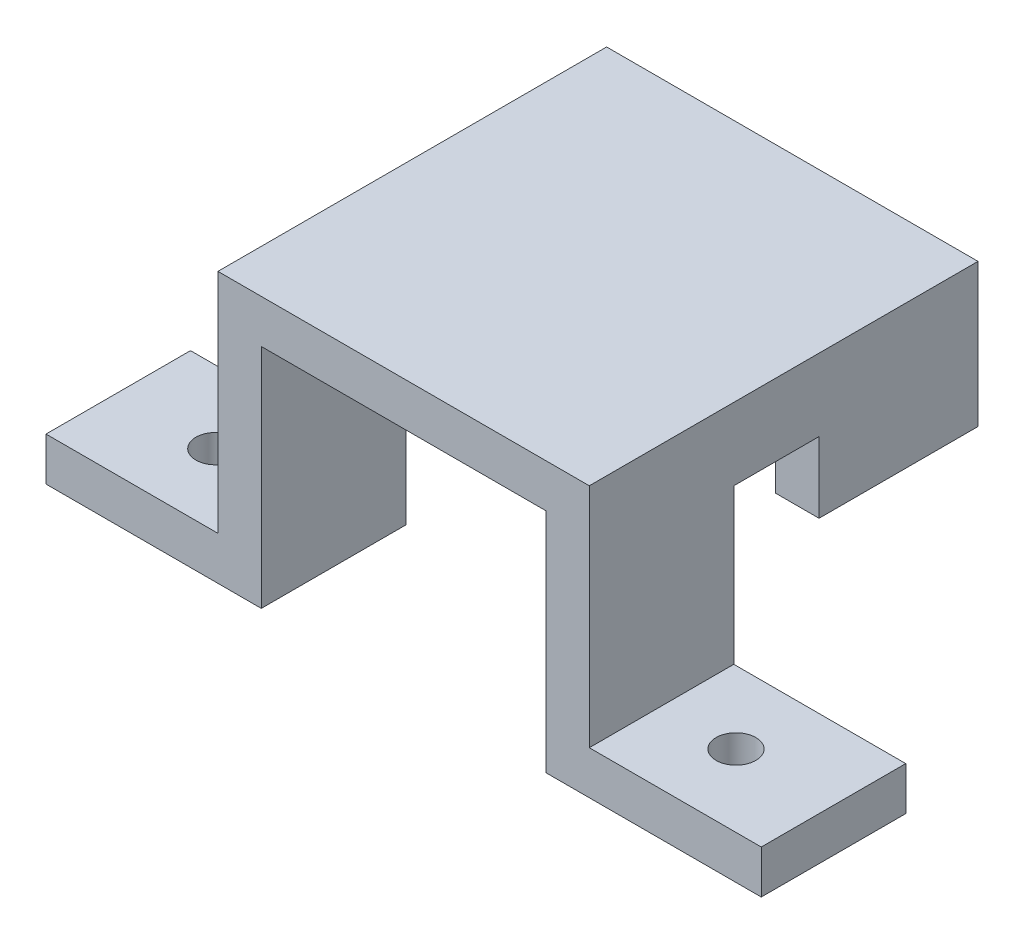
ISO-10303-21;
HEADER;
FILE_DESCRIPTION(('STEP AP214'),'2;1');
FILE_NAME('part.step','',(''),(''),'','','');
FILE_SCHEMA(('AUTOMOTIVE_DESIGN { 1 0 10303 214 1 1 1 1 }'));
ENDSEC;
DATA;
#1=APPLICATION_CONTEXT('core data for automotive mechanical design processes');
#2=APPLICATION_PROTOCOL_DEFINITION('international standard','automotive_design',2000,#1);
#3=PRODUCT_CONTEXT('',#1,'mechanical');
#4=PRODUCT('Part','Part','',(#3));
#5=PRODUCT_RELATED_PRODUCT_CATEGORY('part','',(#4));
#6=PRODUCT_DEFINITION_FORMATION('','',#4);
#7=PRODUCT_DEFINITION_CONTEXT('part definition',#1,'design');
#8=PRODUCT_DEFINITION('design','',#6,#7);
#9=PRODUCT_DEFINITION_SHAPE('','',#8);
#10=(LENGTH_UNIT() NAMED_UNIT(*) SI_UNIT(.MILLI.,.METRE.));
#11=(NAMED_UNIT(*) PLANE_ANGLE_UNIT() SI_UNIT($,.RADIAN.));
#12=(NAMED_UNIT(*) SI_UNIT($,.STERADIAN.) SOLID_ANGLE_UNIT());
#13=UNCERTAINTY_MEASURE_WITH_UNIT(LENGTH_MEASURE(1.E-05),#10,'distance_accuracy_value','');
#14=(GEOMETRIC_REPRESENTATION_CONTEXT(3) GLOBAL_UNCERTAINTY_ASSIGNED_CONTEXT((#13)) GLOBAL_UNIT_ASSIGNED_CONTEXT((#10,
#11,#12)) REPRESENTATION_CONTEXT('',''));
#15=CARTESIAN_POINT('',(0.,0.,0.));
#16=DIRECTION('',(0.,0.,1.));
#17=DIRECTION('',(1.,0.,0.));
#18=AXIS2_PLACEMENT_3D('',#15,#16,#17);
#19=CARTESIAN_POINT('',(14.9,0.,-5.9));
#20=DIRECTION('',(0.,0.,-1.));
#21=DIRECTION('',(-1.,0.,0.));
#22=AXIS2_PLACEMENT_3D('',#19,#20,#21);
#23=PLANE('',#22);
#24=DIRECTION('',(-1.,0.,0.));
#25=VECTOR('',#24,1.);
#26=CARTESIAN_POINT('',(37.6,13.7,-5.9));
#27=LINE('',#26,#25);
#28=CARTESIAN_POINT('',(37.6,13.7,-5.9));
#29=VERTEX_POINT('',#28);
#30=CARTESIAN_POINT('',(34.6,13.7,-5.9));
#31=VERTEX_POINT('',#30);
#32=EDGE_CURVE('E60',#29,#31,#27,.T.);
#33=ORIENTED_EDGE('',*,*,#32,.T.);
#34=DIRECTION('',(0.,-1.,0.));
#35=VECTOR('',#34,1.);
#36=CARTESIAN_POINT('',(34.6,0.,-5.9));
#37=LINE('',#36,#35);
#38=CARTESIAN_POINT('',(34.6,8.8,-5.9));
#39=VERTEX_POINT('',#38);
#40=EDGE_CURVE('E424',#31,#39,#37,.T.);
#41=ORIENTED_EDGE('',*,*,#40,.T.);
#42=DIRECTION('',(-1.,0.,0.));
#43=VECTOR('',#42,1.);
#44=CARTESIAN_POINT('',(0.,8.8,-5.9));
#45=LINE('',#44,#43);
#46=CARTESIAN_POINT('',(37.6,8.8,-5.9));
#47=VERTEX_POINT('',#46);
#48=EDGE_CURVE('E404',#47,#39,#45,.T.);
#49=ORIENTED_EDGE('',*,*,#48,.F.);
#50=DIRECTION('',(0.,-1.,0.));
#51=VECTOR('',#50,1.);
#52=CARTESIAN_POINT('',(37.6,0.,-5.9));
#53=LINE('',#52,#51);
#54=EDGE_CURVE('E402',#29,#47,#53,.T.);
#55=ORIENTED_EDGE('',*,*,#54,.F.);
#56=EDGE_LOOP('',(#33,#41,#49,#55));
#57=FACE_BOUND('',#56,.T.);
#58=ADVANCED_FACE('F37',(#57),#23,.F.);
#59=DIRECTION('',(-1.,0.,0.));
#60=VECTOR('',#59,1.);
#61=CARTESIAN_POINT('',(0.,8.8,-5.9));
#62=LINE('',#61,#60);
#63=CARTESIAN_POINT('',(14.9,8.8,-5.9));
#64=VERTEX_POINT('',#63);
#65=CARTESIAN_POINT('',(11.89875271,8.8,-5.9));
#66=VERTEX_POINT('',#65);
#67=EDGE_CURVE('E397',#64,#66,#62,.T.);
#68=ORIENTED_EDGE('',*,*,#67,.F.);
#69=DIRECTION('',(0.,1.,0.));
#70=VECTOR('',#69,1.);
#71=CARTESIAN_POINT('',(14.9,0.,-5.9));
#72=LINE('',#71,#70);
#73=CARTESIAN_POINT('',(14.9,13.7,-5.9));
#74=VERTEX_POINT('',#73);
#75=EDGE_CURVE('E483',#64,#74,#72,.T.);
#76=ORIENTED_EDGE('',*,*,#75,.T.);
#77=DIRECTION('',(-1.,0.,0.));
#78=VECTOR('',#77,1.);
#79=CARTESIAN_POINT('',(14.9,13.7,-5.9));
#80=LINE('',#79,#78);
#81=CARTESIAN_POINT('',(11.89875271,13.7,-5.9));
#82=VERTEX_POINT('',#81);
#83=EDGE_CURVE('E415',#74,#82,#80,.T.);
#84=ORIENTED_EDGE('',*,*,#83,.T.);
#85=DIRECTION('',(0.,1.,0.));
#86=VECTOR('',#85,1.);
#87=CARTESIAN_POINT('',(11.89875271,0.,-5.9));
#88=LINE('',#87,#86);
#89=EDGE_CURVE('E400',#66,#82,#88,.T.);
#90=ORIENTED_EDGE('',*,*,#89,.F.);
#91=EDGE_LOOP('',(#68,#76,#84,#90));
#92=FACE_BOUND('',#91,.T.);
#93=ADVANCED_FACE('F452',(#92),#23,.F.);
#94=CARTESIAN_POINT('',(37.6,13.7,-8.9));
#95=DIRECTION('',(0.,1.,0.));
#96=DIRECTION('',(0.,0.,1.));
#97=AXIS2_PLACEMENT_3D('',#94,#95,#96);
#98=PLANE('',#97);
#99=ORIENTED_EDGE('',*,*,#32,.F.);
#100=DIRECTION('',(0.,0.,1.));
#101=VECTOR('',#100,1.);
#102=CARTESIAN_POINT('',(37.6,13.7,-8.9));
#103=LINE('',#102,#101);
#104=CARTESIAN_POINT('',(37.6,13.7,0.));
#105=VERTEX_POINT('',#104);
#106=EDGE_CURVE('E289',#29,#105,#103,.T.);
#107=ORIENTED_EDGE('',*,*,#106,.T.);
#108=DIRECTION('',(-1.,0.,0.));
#109=VECTOR('',#108,1.);
#110=CARTESIAN_POINT('',(37.6,13.7,0.));
#111=LINE('',#110,#109);
#112=CARTESIAN_POINT('',(34.6,13.7,0.));
#113=VERTEX_POINT('',#112);
#114=EDGE_CURVE('E271',#105,#113,#111,.T.);
#115=ORIENTED_EDGE('',*,*,#114,.T.);
#116=DIRECTION('',(0.,0.,1.));
#117=VECTOR('',#116,1.);
#118=CARTESIAN_POINT('',(34.6,13.7,-8.9));
#119=LINE('',#118,#117);
#120=EDGE_CURVE('E287',#31,#113,#119,.T.);
#121=ORIENTED_EDGE('',*,*,#120,.F.);
#122=EDGE_LOOP('',(#99,#107,#115,#121));
#123=FACE_BOUND('',#122,.T.);
#124=ADVANCED_FACE('F449',(#123),#98,.F.);
#125=CARTESIAN_POINT('',(14.9,13.7,-8.9));
#126=DIRECTION('',(0.,1.,0.));
#127=DIRECTION('',(0.,0.,1.));
#128=AXIS2_PLACEMENT_3D('',#125,#126,#127);
#129=PLANE('',#128);
#130=ORIENTED_EDGE('',*,*,#83,.F.);
#131=DIRECTION('',(0.,0.,1.));
#132=VECTOR('',#131,1.);
#133=CARTESIAN_POINT('',(14.9,13.7,-8.9));
#134=LINE('',#133,#132);
#135=CARTESIAN_POINT('',(14.9,13.7,0.));
#136=VERTEX_POINT('',#135);
#137=EDGE_CURVE('E281',#74,#136,#134,.T.);
#138=ORIENTED_EDGE('',*,*,#137,.T.);
#139=DIRECTION('',(-1.,0.,0.));
#140=VECTOR('',#139,1.);
#141=CARTESIAN_POINT('',(14.9,13.7,0.));
#142=LINE('',#141,#140);
#143=CARTESIAN_POINT('',(11.89875271,13.7,0.));
#144=VERTEX_POINT('',#143);
#145=EDGE_CURVE('E274',#136,#144,#142,.T.);
#146=ORIENTED_EDGE('',*,*,#145,.T.);
#147=DIRECTION('',(0.,0.,1.));
#148=VECTOR('',#147,1.);
#149=CARTESIAN_POINT('',(11.89875271,13.7,-8.9));
#150=LINE('',#149,#148);
#151=EDGE_CURVE('E279',#82,#144,#150,.T.);
#152=ORIENTED_EDGE('',*,*,#151,.F.);
#153=EDGE_LOOP('',(#130,#138,#146,#152));
#154=FACE_BOUND('',#153,.T.);
#155=ADVANCED_FACE('F451',(#154),#129,.F.);
#156=CARTESIAN_POINT('',(34.6,18.7,0.));
#157=DIRECTION('',(1.,0.,0.));
#158=DIRECTION('',(0.,0.,-1.));
#159=AXIS2_PLACEMENT_3D('',#156,#157,#158);
#160=PLANE('',#159);
#161=DIRECTION('',(0.,-1.,0.));
#162=VECTOR('',#161,1.);
#163=CARTESIAN_POINT('',(34.6,18.7,10.));
#164=LINE('',#163,#162);
#165=CARTESIAN_POINT('',(34.6,15.7,10.));
#166=VERTEX_POINT('',#165);
#167=CARTESIAN_POINT('',(34.6,0.,10.));
#168=VERTEX_POINT('',#167);
#169=EDGE_CURVE('E301',#166,#168,#164,.T.);
#170=ORIENTED_EDGE('',*,*,#169,.F.);
#171=DIRECTION('',(0.,0.,1.));
#172=VECTOR('',#171,1.);
#173=CARTESIAN_POINT('',(34.6,15.7,-8.9));
#174=LINE('',#173,#172);
#175=CARTESIAN_POINT('',(34.6,15.7,-16.9));
#176=VERTEX_POINT('',#175);
#177=EDGE_CURVE('E285',#176,#166,#174,.T.);
#178=ORIENTED_EDGE('',*,*,#177,.F.);
#179=DIRECTION('',(0.,1.,0.));
#180=VECTOR('',#179,1.);
#181=CARTESIAN_POINT('',(34.6000000000001,1.20042864537595E-13,-16.9));
#182=LINE('',#181,#180);
#183=CARTESIAN_POINT('',(34.6,8.8,-16.9));
#184=VERTEX_POINT('',#183);
#185=EDGE_CURVE('E431',#184,#176,#182,.T.);
#186=ORIENTED_EDGE('',*,*,#185,.F.);
#187=DIRECTION('',(0.,0.,-1.));
#188=VECTOR('',#187,1.);
#189=CARTESIAN_POINT('',(34.6,8.8,-5.9));
#190=LINE('',#189,#188);
#191=EDGE_CURVE('E408',#39,#184,#190,.T.);
#192=ORIENTED_EDGE('',*,*,#191,.F.);
#193=ORIENTED_EDGE('',*,*,#40,.F.);
#194=ORIENTED_EDGE('',*,*,#120,.T.);
#195=DIRECTION('',(0.,-1.,0.));
#196=VECTOR('',#195,1.);
#197=CARTESIAN_POINT('',(34.6,18.7,0.));
#198=LINE('',#197,#196);
#199=CARTESIAN_POINT('',(34.6,0.,0.));
#200=VERTEX_POINT('',#199);
#201=EDGE_CURVE('E303',#113,#200,#198,.T.);
#202=ORIENTED_EDGE('',*,*,#201,.T.);
#203=DIRECTION('',(0.,0.,1.));
#204=VECTOR('',#203,1.);
#205=CARTESIAN_POINT('',(34.6,0.,0.));
#206=LINE('',#205,#204);
#207=EDGE_CURVE('E291',#200,#168,#206,.T.);
#208=ORIENTED_EDGE('',*,*,#207,.T.);
#209=EDGE_LOOP('',(#170,#178,#186,#192,#193,#194,#202,#208));
#210=FACE_BOUND('',#209,.T.);
#211=ADVANCED_FACE('F433',(#210),#160,.F.);
#212=CARTESIAN_POINT('',(34.6,15.7,-8.9));
#213=DIRECTION('',(0.,1.,0.));
#214=DIRECTION('',(0.,0.,1.));
#215=AXIS2_PLACEMENT_3D('',#212,#213,#214);
#216=PLANE('',#215);
#217=ORIENTED_EDGE('',*,*,#177,.T.);
#218=DIRECTION('',(-1.,0.,0.));
#219=VECTOR('',#218,1.);
#220=CARTESIAN_POINT('',(49.502,15.7,10.));
#221=LINE('',#220,#219);
#222=CARTESIAN_POINT('',(14.9,15.7,10.));
#223=VERTEX_POINT('',#222);
#224=EDGE_CURVE('E219',#166,#223,#221,.T.);
#225=ORIENTED_EDGE('',*,*,#224,.T.);
#226=DIRECTION('',(0.,0.,1.));
#227=VECTOR('',#226,1.);
#228=CARTESIAN_POINT('',(14.9,15.7,-8.9));
#229=LINE('',#228,#227);
#230=CARTESIAN_POINT('',(14.9,15.7,-16.9));
#231=VERTEX_POINT('',#230);
#232=EDGE_CURVE('E283',#231,#223,#229,.T.);
#233=ORIENTED_EDGE('',*,*,#232,.F.);
#234=DIRECTION('',(-1.,0.,0.));
#235=VECTOR('',#234,1.);
#236=CARTESIAN_POINT('',(0.,15.7,-16.9));
#237=LINE('',#236,#235);
#238=EDGE_CURVE('E435',#176,#231,#237,.T.);
#239=ORIENTED_EDGE('',*,*,#238,.F.);
#240=EDGE_LOOP('',(#217,#225,#233,#239));
#241=FACE_BOUND('',#240,.T.);
#242=DIRECTION('',(0.,0.,-1.));
#243=VECTOR('',#242,1.);
#244=CARTESIAN_POINT('',(20.9,15.7,-3.9));
#245=LINE('',#244,#243);
#246=CARTESIAN_POINT('',(20.9,15.7,-5.9));
#247=VERTEX_POINT('',#246);
#248=CARTESIAN_POINT('',(20.9,15.7,-8.9));
#249=VERTEX_POINT('',#248);
#250=EDGE_CURVE('E212',#247,#249,#245,.T.);
#251=ORIENTED_EDGE('',*,*,#250,.F.);
#252=DIRECTION('',(-1.,0.,0.));
#253=VECTOR('',#252,1.);
#254=CARTESIAN_POINT('',(14.9,15.7,-5.9));
#255=LINE('',#254,#253);
#256=CARTESIAN_POINT('',(28.6,15.7,-5.9));
#257=VERTEX_POINT('',#256);
#258=EDGE_CURVE('E217',#257,#247,#255,.T.);
#259=ORIENTED_EDGE('',*,*,#258,.F.);
#260=DIRECTION('',(0.,0.,-1.));
#261=VECTOR('',#260,1.);
#262=CARTESIAN_POINT('',(28.6,15.7,-3.9));
#263=LINE('',#262,#261);
#264=CARTESIAN_POINT('',(28.6,15.7,-8.9));
#265=VERTEX_POINT('',#264);
#266=EDGE_CURVE('E211',#257,#265,#263,.T.);
#267=ORIENTED_EDGE('',*,*,#266,.T.);
#268=DIRECTION('',(-1.,0.,0.));
#269=VECTOR('',#268,1.);
#270=CARTESIAN_POINT('',(0.,15.7,-8.9));
#271=LINE('',#270,#269);
#272=EDGE_CURVE('E210',#265,#249,#271,.T.);
#273=ORIENTED_EDGE('',*,*,#272,.T.);
#274=EDGE_LOOP('',(#251,#259,#267,#273));
#275=FACE_BOUND('',#274,.T.);
#276=ADVANCED_FACE('F447',(#241,#275),#216,.F.);
#277=CARTESIAN_POINT('',(14.9,15.7,-8.9));
#278=DIRECTION('',(-1.,0.,0.));
#279=DIRECTION('',(0.,0.,1.));
#280=AXIS2_PLACEMENT_3D('',#277,#278,#279);
#281=PLANE('',#280);
#282=ORIENTED_EDGE('',*,*,#232,.T.);
#283=DIRECTION('',(0.,-1.,0.));
#284=VECTOR('',#283,1.);
#285=CARTESIAN_POINT('',(14.9,18.7,10.));
#286=LINE('',#285,#284);
#287=CARTESIAN_POINT('',(14.9,0.,10.));
#288=VERTEX_POINT('',#287);
#289=EDGE_CURVE('E231',#223,#288,#286,.T.);
#290=ORIENTED_EDGE('',*,*,#289,.T.);
#291=DIRECTION('',(0.,0.,1.));
#292=VECTOR('',#291,1.);
#293=CARTESIAN_POINT('',(14.9,0.,0.));
#294=LINE('',#293,#292);
#295=CARTESIAN_POINT('',(14.9,0.,0.));
#296=VERTEX_POINT('',#295);
#297=EDGE_CURVE('E228',#296,#288,#294,.T.);
#298=ORIENTED_EDGE('',*,*,#297,.F.);
#299=DIRECTION('',(0.,-1.,0.));
#300=VECTOR('',#299,1.);
#301=CARTESIAN_POINT('',(14.9,18.7,0.));
#302=LINE('',#301,#300);
#303=EDGE_CURVE('E238',#136,#296,#302,.T.);
#304=ORIENTED_EDGE('',*,*,#303,.F.);
#305=ORIENTED_EDGE('',*,*,#137,.F.);
#306=ORIENTED_EDGE('',*,*,#75,.F.);
#307=DIRECTION('',(0.,0.,-1.));
#308=VECTOR('',#307,1.);
#309=CARTESIAN_POINT('',(14.9,8.8,-5.9));
#310=LINE('',#309,#308);
#311=CARTESIAN_POINT('',(14.9,8.8,-16.9));
#312=VERTEX_POINT('',#311);
#313=EDGE_CURVE('E407',#64,#312,#310,.T.);
#314=ORIENTED_EDGE('',*,*,#313,.T.);
#315=DIRECTION('',(0.,1.,0.));
#316=VECTOR('',#315,1.);
#317=CARTESIAN_POINT('',(14.9,0.,-16.9));
#318=LINE('',#317,#316);
#319=EDGE_CURVE('E389',#312,#231,#318,.T.);
#320=ORIENTED_EDGE('',*,*,#319,.T.);
#321=EDGE_LOOP('',(#282,#290,#298,#304,#305,#306,#314,#320));
#322=FACE_BOUND('',#321,.T.);
#323=ADVANCED_FACE('F443',(#322),#281,.F.);
#324=CARTESIAN_POINT('',(0.,3.,0.));
#325=DIRECTION('',(0.,0.,-1.));
#326=DIRECTION('',(-1.,0.,0.));
#327=AXIS2_PLACEMENT_3D('',#324,#325,#326);
#328=PLANE('',#327);
#329=ORIENTED_EDGE('',*,*,#114,.F.);
#330=DIRECTION('',(0.,-1.,0.));
#331=VECTOR('',#330,1.);
#332=CARTESIAN_POINT('',(37.6,18.7,0.));
#333=LINE('',#332,#331);
#334=CARTESIAN_POINT('',(37.6,3.,0.));
#335=VERTEX_POINT('',#334);
#336=EDGE_CURVE('E305',#105,#335,#333,.T.);
#337=ORIENTED_EDGE('',*,*,#336,.T.);
#338=DIRECTION('',(1.,0.,0.));
#339=VECTOR('',#338,1.);
#340=CARTESIAN_POINT('',(0.,3.,0.));
#341=LINE('',#340,#339);
#342=CARTESIAN_POINT('',(49.5,3.,0.));
#343=VERTEX_POINT('',#342);
#344=EDGE_CURVE('E308',#335,#343,#341,.T.);
#345=ORIENTED_EDGE('',*,*,#344,.T.);
#346=DIRECTION('',(0.,-1.,0.));
#347=VECTOR('',#346,1.);
#348=CARTESIAN_POINT('',(49.5,3.,0.));
#349=LINE('',#348,#347);
#350=CARTESIAN_POINT('',(49.5,0.,0.));
#351=VERTEX_POINT('',#350);
#352=EDGE_CURVE('E323',#343,#351,#349,.T.);
#353=ORIENTED_EDGE('',*,*,#352,.T.);
#354=DIRECTION('',(1.,0.,0.));
#355=VECTOR('',#354,1.);
#356=CARTESIAN_POINT('',(0.,0.,0.));
#357=LINE('',#356,#355);
#358=EDGE_CURVE('E307',#200,#351,#357,.T.);
#359=ORIENTED_EDGE('',*,*,#358,.F.);
#360=ORIENTED_EDGE('',*,*,#201,.F.);
#361=EDGE_LOOP('',(#329,#337,#345,#353,#359,#360));
#362=FACE_BOUND('',#361,.T.);
#363=ADVANCED_FACE('F39',(#362),#328,.T.);
#364=CARTESIAN_POINT('',(0.,3.,10.));
#365=DIRECTION('',(0.,0.,-1.));
#366=DIRECTION('',(-1.,0.,0.));
#367=AXIS2_PLACEMENT_3D('',#364,#365,#366);
#368=PLANE('',#367);
#369=DIRECTION('',(1.,0.,0.));
#370=VECTOR('',#369,1.);
#371=CARTESIAN_POINT('',(0.,0.,10.));
#372=LINE('',#371,#370);
#373=CARTESIAN_POINT('',(49.5,0.,10.));
#374=VERTEX_POINT('',#373);
#375=EDGE_CURVE('E326',#168,#374,#372,.T.);
#376=ORIENTED_EDGE('',*,*,#375,.T.);
#377=DIRECTION('',(0.,-1.,0.));
#378=VECTOR('',#377,1.);
#379=CARTESIAN_POINT('',(49.5,3.,10.));
#380=LINE('',#379,#378);
#381=CARTESIAN_POINT('',(49.5,3.,10.));
#382=VERTEX_POINT('',#381);
#383=EDGE_CURVE('E335',#382,#374,#380,.T.);
#384=ORIENTED_EDGE('',*,*,#383,.F.);
#385=DIRECTION('',(1.,0.,0.));
#386=VECTOR('',#385,1.);
#387=CARTESIAN_POINT('',(0.,3.,10.));
#388=LINE('',#387,#386);
#389=CARTESIAN_POINT('',(37.6,3.,10.));
#390=VERTEX_POINT('',#389);
#391=EDGE_CURVE('E315',#390,#382,#388,.T.);
#392=ORIENTED_EDGE('',*,*,#391,.F.);
#393=DIRECTION('',(0.,-1.,0.));
#394=VECTOR('',#393,1.);
#395=CARTESIAN_POINT('',(37.6,18.7,10.));
#396=LINE('',#395,#394);
#397=CARTESIAN_POINT('',(37.6,18.7,10.));
#398=VERTEX_POINT('',#397);
#399=EDGE_CURVE('E297',#398,#390,#396,.T.);
#400=ORIENTED_EDGE('',*,*,#399,.F.);
#401=DIRECTION('',(1.,0.,0.));
#402=VECTOR('',#401,1.);
#403=CARTESIAN_POINT('',(0.,18.7,10.));
#404=LINE('',#403,#402);
#405=CARTESIAN_POINT('',(11.89875271,18.7,10.));
#406=VERTEX_POINT('',#405);
#407=EDGE_CURVE('E294',#406,#398,#404,.T.);
#408=ORIENTED_EDGE('',*,*,#407,.F.);
#409=DIRECTION('',(0.,-1.,0.));
#410=VECTOR('',#409,1.);
#411=CARTESIAN_POINT('',(11.89875271,18.7,10.));
#412=LINE('',#411,#410);
#413=CARTESIAN_POINT('',(11.89875271,3.,10.));
#414=VERTEX_POINT('',#413);
#415=EDGE_CURVE('E233',#406,#414,#412,.T.);
#416=ORIENTED_EDGE('',*,*,#415,.T.);
#417=DIRECTION('',(1.,0.,0.));
#418=VECTOR('',#417,1.);
#419=CARTESIAN_POINT('',(0.,3.,10.));
#420=LINE('',#419,#418);
#421=CARTESIAN_POINT('',(0.,3.,10.));
#422=VERTEX_POINT('',#421);
#423=EDGE_CURVE('E254',#422,#414,#420,.T.);
#424=ORIENTED_EDGE('',*,*,#423,.F.);
#425=DIRECTION('',(0.,-1.,0.));
#426=VECTOR('',#425,1.);
#427=CARTESIAN_POINT('',(0.,3.,10.));
#428=LINE('',#427,#426);
#429=CARTESIAN_POINT('',(0.,0.,10.));
#430=VERTEX_POINT('',#429);
#431=EDGE_CURVE('E256',#422,#430,#428,.T.);
#432=ORIENTED_EDGE('',*,*,#431,.T.);
#433=DIRECTION('',(1.,0.,0.));
#434=VECTOR('',#433,1.);
#435=CARTESIAN_POINT('',(0.,0.,10.));
#436=LINE('',#435,#434);
#437=EDGE_CURVE('E245',#430,#288,#436,.T.);
#438=ORIENTED_EDGE('',*,*,#437,.T.);
#439=ORIENTED_EDGE('',*,*,#289,.F.);
#440=ORIENTED_EDGE('',*,*,#224,.F.);
#441=ORIENTED_EDGE('',*,*,#169,.T.);
#442=EDGE_LOOP('',(#376,#384,#392,#400,#408,#416,#424,#432,#438,#439,#440,#441));
#443=FACE_BOUND('',#442,.T.);
#444=ADVANCED_FACE('F344',(#443),#368,.F.);
#445=CARTESIAN_POINT('',(49.5,3.,0.));
#446=DIRECTION('',(1.,0.,0.));
#447=DIRECTION('',(0.,0.,-1.));
#448=AXIS2_PLACEMENT_3D('',#445,#446,#447);
#449=PLANE('',#448);
#450=DIRECTION('',(0.,0.,1.));
#451=VECTOR('',#450,1.);
#452=CARTESIAN_POINT('',(49.5,0.,0.));
#453=LINE('',#452,#451);
#454=EDGE_CURVE('E329',#351,#374,#453,.T.);
#455=ORIENTED_EDGE('',*,*,#454,.F.);
#456=ORIENTED_EDGE('',*,*,#352,.F.);
#457=DIRECTION('',(0.,0.,1.));
#458=VECTOR('',#457,1.);
#459=CARTESIAN_POINT('',(49.5,3.,0.));
#460=LINE('',#459,#458);
#461=EDGE_CURVE('E317',#343,#382,#460,.T.);
#462=ORIENTED_EDGE('',*,*,#461,.T.);
#463=ORIENTED_EDGE('',*,*,#383,.T.);
#464=EDGE_LOOP('',(#455,#456,#462,#463));
#465=FACE_BOUND('',#464,.T.);
#466=ADVANCED_FACE('F339',(#465),#449,.T.);
#467=CARTESIAN_POINT('',(42.75,3.,5.));
#468=DIRECTION('',(0.,-1.,0.));
#469=DIRECTION('',(0.,0.,-1.));
#470=AXIS2_PLACEMENT_3D('',#467,#468,#469);
#471=CYLINDRICAL_SURFACE('',#470,1.375);
#472=CARTESIAN_POINT('',(42.75,3.,5.));
#473=DIRECTION('',(0.,1.,0.));
#474=DIRECTION('',(0.,0.,1.));
#475=AXIS2_PLACEMENT_3D('',#472,#473,#474);
#476=CIRCLE('',#475,1.375);
#477=CARTESIAN_POINT('',(42.75,3.,6.375));
#478=VERTEX_POINT('',#477);
#479=EDGE_CURVE('E320',#478,#478,#476,.F.);
#480=ORIENTED_EDGE('',*,*,#479,.F.);
#481=EDGE_LOOP('',(#480));
#482=FACE_BOUND('',#481,.T.);
#483=CARTESIAN_POINT('',(42.75,0.,5.));
#484=DIRECTION('',(0.,1.,0.));
#485=DIRECTION('',(0.,0.,1.));
#486=AXIS2_PLACEMENT_3D('',#483,#484,#485);
#487=CIRCLE('',#486,1.375);
#488=CARTESIAN_POINT('',(42.75,0.,6.375));
#489=VERTEX_POINT('',#488);
#490=EDGE_CURVE('E312',#489,#489,#487,.F.);
#491=ORIENTED_EDGE('',*,*,#490,.T.);
#492=EDGE_LOOP('',(#491));
#493=FACE_BOUND('',#492,.T.);
#494=ADVANCED_FACE('F553',(#482,#493),#471,.F.);
#495=CARTESIAN_POINT('',(0.,3.,0.));
#496=DIRECTION('',(0.,1.,0.));
#497=DIRECTION('',(0.,0.,1.));
#498=AXIS2_PLACEMENT_3D('',#495,#496,#497);
#499=PLANE('',#498);
#500=ORIENTED_EDGE('',*,*,#344,.F.);
#501=DIRECTION('',(0.,0.,1.));
#502=VECTOR('',#501,1.);
#503=CARTESIAN_POINT('',(37.6,3.,0.));
#504=LINE('',#503,#502);
#505=EDGE_CURVE('E311',#335,#390,#504,.T.);
#506=ORIENTED_EDGE('',*,*,#505,.T.);
#507=ORIENTED_EDGE('',*,*,#391,.T.);
#508=ORIENTED_EDGE('',*,*,#461,.F.);
#509=EDGE_LOOP('',(#500,#506,#507,#508));
#510=FACE_BOUND('',#509,.T.);
#511=ORIENTED_EDGE('',*,*,#479,.T.);
#512=EDGE_LOOP('',(#511));
#513=FACE_BOUND('',#512,.T.);
#514=ADVANCED_FACE('F359',(#510,#513),#499,.T.);
#515=CARTESIAN_POINT('',(0.,0.,0.));
#516=DIRECTION('',(0.,1.,0.));
#517=DIRECTION('',(0.,0.,1.));
#518=AXIS2_PLACEMENT_3D('',#515,#516,#517);
#519=PLANE('',#518);
#520=ORIENTED_EDGE('',*,*,#358,.T.);
#521=ORIENTED_EDGE('',*,*,#454,.T.);
#522=ORIENTED_EDGE('',*,*,#375,.F.);
#523=ORIENTED_EDGE('',*,*,#207,.F.);
#524=EDGE_LOOP('',(#520,#521,#522,#523));
#525=FACE_BOUND('',#524,.T.);
#526=ORIENTED_EDGE('',*,*,#490,.F.);
#527=EDGE_LOOP('',(#526));
#528=FACE_BOUND('',#527,.T.);
#529=ADVANCED_FACE('F349',(#525,#528),#519,.F.);
#530=CARTESIAN_POINT('',(37.6,18.7,0.));
#531=DIRECTION('',(1.,0.,0.));
#532=DIRECTION('',(0.,0.,-1.));
#533=AXIS2_PLACEMENT_3D('',#530,#531,#532);
#534=PLANE('',#533);
#535=DIRECTION('',(0.,0.,1.));
#536=VECTOR('',#535,1.);
#537=CARTESIAN_POINT('',(37.6,18.7,0.));
#538=LINE('',#537,#536);
#539=CARTESIAN_POINT('',(37.6,18.7,-16.9));
#540=VERTEX_POINT('',#539);
#541=EDGE_CURVE('E292',#540,#398,#538,.T.);
#542=ORIENTED_EDGE('',*,*,#541,.T.);
#543=ORIENTED_EDGE('',*,*,#399,.T.);
#544=ORIENTED_EDGE('',*,*,#505,.F.);
#545=ORIENTED_EDGE('',*,*,#336,.F.);
#546=ORIENTED_EDGE('',*,*,#106,.F.);
#547=ORIENTED_EDGE('',*,*,#54,.T.);
#548=DIRECTION('',(0.,0.,-1.));
#549=VECTOR('',#548,1.);
#550=CARTESIAN_POINT('',(37.6,8.8,-5.9));
#551=LINE('',#550,#549);
#552=CARTESIAN_POINT('',(37.6,8.8,-16.9));
#553=VERTEX_POINT('',#552);
#554=EDGE_CURVE('E410',#47,#553,#551,.T.);
#555=ORIENTED_EDGE('',*,*,#554,.T.);
#556=DIRECTION('',(0.,-1.,0.));
#557=VECTOR('',#556,1.);
#558=CARTESIAN_POINT('',(37.6,0.,-16.9));
#559=LINE('',#558,#557);
#560=EDGE_CURVE('E368',#540,#553,#559,.T.);
#561=ORIENTED_EDGE('',*,*,#560,.F.);
#562=EDGE_LOOP('',(#542,#543,#544,#545,#546,#547,#555,#561));
#563=FACE_BOUND('',#562,.T.);
#564=ADVANCED_FACE('F365',(#563),#534,.T.);
#565=CARTESIAN_POINT('',(0.,18.7,0.));
#566=DIRECTION('',(0.,1.,0.));
#567=DIRECTION('',(0.,0.,1.));
#568=AXIS2_PLACEMENT_3D('',#565,#566,#567);
#569=PLANE('',#568);
#570=DIRECTION('',(0.,0.,1.));
#571=VECTOR('',#570,1.);
#572=CARTESIAN_POINT('',(11.89875271,18.7,-8.9));
#573=LINE('',#572,#571);
#574=CARTESIAN_POINT('',(11.89875271,18.7,-16.9));
#575=VERTEX_POINT('',#574);
#576=EDGE_CURVE('E277',#575,#406,#573,.T.);
#577=ORIENTED_EDGE('',*,*,#576,.T.);
#578=ORIENTED_EDGE('',*,*,#407,.T.);
#579=ORIENTED_EDGE('',*,*,#541,.F.);
#580=DIRECTION('',(1.,0.,0.));
#581=VECTOR('',#580,1.);
#582=CARTESIAN_POINT('',(0.,18.7,-16.9));
#583=LINE('',#582,#581);
#584=EDGE_CURVE('E373',#575,#540,#583,.T.);
#585=ORIENTED_EDGE('',*,*,#584,.F.);
#586=EDGE_LOOP('',(#577,#578,#579,#585));
#587=FACE_BOUND('',#586,.T.);
#588=ADVANCED_FACE('F372',(#587),#569,.T.);
#589=CARTESIAN_POINT('',(11.89875271,18.7,-8.9));
#590=DIRECTION('',(1.,0.,0.));
#591=DIRECTION('',(0.,0.,-1.));
#592=AXIS2_PLACEMENT_3D('',#589,#590,#591);
#593=PLANE('',#592);
#594=ORIENTED_EDGE('',*,*,#89,.T.);
#595=ORIENTED_EDGE('',*,*,#151,.T.);
#596=DIRECTION('',(0.,-1.,0.));
#597=VECTOR('',#596,1.);
#598=CARTESIAN_POINT('',(11.89875271,18.7,0.));
#599=LINE('',#598,#597);
#600=CARTESIAN_POINT('',(11.89875271,3.,0.));
#601=VERTEX_POINT('',#600);
#602=EDGE_CURVE('E236',#144,#601,#599,.T.);
#603=ORIENTED_EDGE('',*,*,#602,.T.);
#604=DIRECTION('',(0.,0.,1.));
#605=VECTOR('',#604,1.);
#606=CARTESIAN_POINT('',(11.89875271,3.,0.));
#607=LINE('',#606,#605);
#608=EDGE_CURVE('E244',#601,#414,#607,.T.);
#609=ORIENTED_EDGE('',*,*,#608,.T.);
#610=ORIENTED_EDGE('',*,*,#415,.F.);
#611=ORIENTED_EDGE('',*,*,#576,.F.);
#612=DIRECTION('',(0.,1.,0.));
#613=VECTOR('',#612,1.);
#614=CARTESIAN_POINT('',(11.89875271,0.,-16.9));
#615=LINE('',#614,#613);
#616=CARTESIAN_POINT('',(11.89875271,8.8,-16.9));
#617=VERTEX_POINT('',#616);
#618=EDGE_CURVE('E379',#617,#575,#615,.T.);
#619=ORIENTED_EDGE('',*,*,#618,.F.);
#620=DIRECTION('',(0.,0.,-1.));
#621=VECTOR('',#620,1.);
#622=CARTESIAN_POINT('',(11.89875271,8.8,-5.9));
#623=LINE('',#622,#621);
#624=EDGE_CURVE('E412',#66,#617,#623,.T.);
#625=ORIENTED_EDGE('',*,*,#624,.F.);
#626=EDGE_LOOP('',(#594,#595,#603,#609,#610,#611,#619,#625));
#627=FACE_BOUND('',#626,.T.);
#628=ADVANCED_FACE('F378',(#627),#593,.F.);
#629=CARTESIAN_POINT('',(0.,0.,-8.9));
#630=DIRECTION('',(0.,0.,-1.));
#631=DIRECTION('',(-1.,0.,0.));
#632=AXIS2_PLACEMENT_3D('',#629,#630,#631);
#633=PLANE('',#632);
#634=DIRECTION('',(0.,1.,0.));
#635=VECTOR('',#634,1.);
#636=CARTESIAN_POINT('',(28.6,0.,-8.9));
#637=LINE('',#636,#635);
#638=CARTESIAN_POINT('',(28.6,0.,-8.9));
#639=VERTEX_POINT('',#638);
#640=EDGE_CURVE('E52',#639,#265,#637,.T.);
#641=ORIENTED_EDGE('',*,*,#640,.F.);
#642=DIRECTION('',(1.,0.,0.));
#643=VECTOR('',#642,1.);
#644=CARTESIAN_POINT('',(14.9,0.,-8.9));
#645=LINE('',#644,#643);
#646=CARTESIAN_POINT('',(20.9,0.,-8.9));
#647=VERTEX_POINT('',#646);
#648=EDGE_CURVE('E208',#647,#639,#645,.T.);
#649=ORIENTED_EDGE('',*,*,#648,.F.);
#650=DIRECTION('',(0.,-1.,0.));
#651=VECTOR('',#650,1.);
#652=CARTESIAN_POINT('',(20.9,0.,-8.9));
#653=LINE('',#652,#651);
#654=EDGE_CURVE('E488',#249,#647,#653,.T.);
#655=ORIENTED_EDGE('',*,*,#654,.F.);
#656=ORIENTED_EDGE('',*,*,#272,.F.);
#657=EDGE_LOOP('',(#641,#649,#655,#656));
#658=FACE_BOUND('',#657,.T.);
#659=ADVANCED_FACE('F206',(#658),#633,.T.);
#660=CARTESIAN_POINT('',(0.,3.,0.));
#661=DIRECTION('',(0.,0.,-1.));
#662=DIRECTION('',(-1.,0.,0.));
#663=AXIS2_PLACEMENT_3D('',#660,#661,#662);
#664=PLANE('',#663);
#665=ORIENTED_EDGE('',*,*,#145,.F.);
#666=ORIENTED_EDGE('',*,*,#303,.T.);
#667=DIRECTION('',(1.,0.,0.));
#668=VECTOR('',#667,1.);
#669=CARTESIAN_POINT('',(0.,0.,0.));
#670=LINE('',#669,#668);
#671=CARTESIAN_POINT('',(0.,0.,0.));
#672=VERTEX_POINT('',#671);
#673=EDGE_CURVE('E259',#672,#296,#670,.T.);
#674=ORIENTED_EDGE('',*,*,#673,.F.);
#675=DIRECTION('',(0.,-1.,0.));
#676=VECTOR('',#675,1.);
#677=CARTESIAN_POINT('',(0.,3.,0.));
#678=LINE('',#677,#676);
#679=CARTESIAN_POINT('',(0.,3.,0.));
#680=VERTEX_POINT('',#679);
#681=EDGE_CURVE('E269',#680,#672,#678,.T.);
#682=ORIENTED_EDGE('',*,*,#681,.F.);
#683=DIRECTION('',(1.,0.,0.));
#684=VECTOR('',#683,1.);
#685=CARTESIAN_POINT('',(0.,3.,0.));
#686=LINE('',#685,#684);
#687=EDGE_CURVE('E248',#680,#601,#686,.T.);
#688=ORIENTED_EDGE('',*,*,#687,.T.);
#689=ORIENTED_EDGE('',*,*,#602,.F.);
#690=EDGE_LOOP('',(#665,#666,#674,#682,#688,#689));
#691=FACE_BOUND('',#690,.T.);
#692=ADVANCED_FACE('F515',(#691),#664,.T.);
#693=CARTESIAN_POINT('',(0.,3.,0.));
#694=DIRECTION('',(1.,0.,0.));
#695=DIRECTION('',(0.,0.,-1.));
#696=AXIS2_PLACEMENT_3D('',#693,#694,#695);
#697=PLANE('',#696);
#698=DIRECTION('',(0.,0.,1.));
#699=VECTOR('',#698,1.);
#700=CARTESIAN_POINT('',(0.,0.,0.));
#701=LINE('',#700,#699);
#702=EDGE_CURVE('E262',#672,#430,#701,.T.);
#703=ORIENTED_EDGE('',*,*,#702,.T.);
#704=ORIENTED_EDGE('',*,*,#431,.F.);
#705=DIRECTION('',(0.,0.,1.));
#706=VECTOR('',#705,1.);
#707=CARTESIAN_POINT('',(0.,3.,0.));
#708=LINE('',#707,#706);
#709=EDGE_CURVE('E251',#680,#422,#708,.T.);
#710=ORIENTED_EDGE('',*,*,#709,.F.);
#711=ORIENTED_EDGE('',*,*,#681,.T.);
#712=EDGE_LOOP('',(#703,#704,#710,#711));
#713=FACE_BOUND('',#712,.T.);
#714=ADVANCED_FACE('F523',(#713),#697,.F.);
#715=CARTESIAN_POINT('',(6.75,3.,5.));
#716=DIRECTION('',(0.,-1.,0.));
#717=DIRECTION('',(0.,0.,-1.));
#718=AXIS2_PLACEMENT_3D('',#715,#716,#717);
#719=CYLINDRICAL_SURFACE('',#718,1.375);
#720=CARTESIAN_POINT('',(6.75,3.,5.));
#721=DIRECTION('',(0.,1.,0.));
#722=DIRECTION('',(0.,0.,1.));
#723=AXIS2_PLACEMENT_3D('',#720,#721,#722);
#724=CIRCLE('',#723,1.375);
#725=CARTESIAN_POINT('',(6.75,3.,6.375));
#726=VERTEX_POINT('',#725);
#727=EDGE_CURVE('E241',#726,#726,#724,.T.);
#728=ORIENTED_EDGE('',*,*,#727,.T.);
#729=EDGE_LOOP('',(#728));
#730=FACE_BOUND('',#729,.T.);
#731=CARTESIAN_POINT('',(6.75,0.,5.));
#732=DIRECTION('',(0.,1.,0.));
#733=DIRECTION('',(0.,0.,1.));
#734=AXIS2_PLACEMENT_3D('',#731,#732,#733);
#735=CIRCLE('',#734,1.375);
#736=CARTESIAN_POINT('',(6.75,0.,6.375));
#737=VERTEX_POINT('',#736);
#738=EDGE_CURVE('E240',#737,#737,#735,.T.);
#739=ORIENTED_EDGE('',*,*,#738,.F.);
#740=EDGE_LOOP('',(#739));
#741=FACE_BOUND('',#740,.T.);
#742=ADVANCED_FACE('F526',(#730,#741),#719,.F.);
#743=CARTESIAN_POINT('',(0.,3.,0.));
#744=DIRECTION('',(0.,1.,0.));
#745=DIRECTION('',(0.,0.,1.));
#746=AXIS2_PLACEMENT_3D('',#743,#744,#745);
#747=PLANE('',#746);
#748=ORIENTED_EDGE('',*,*,#727,.F.);
#749=EDGE_LOOP('',(#748));
#750=FACE_BOUND('',#749,.T.);
#751=ORIENTED_EDGE('',*,*,#608,.F.);
#752=ORIENTED_EDGE('',*,*,#687,.F.);
#753=ORIENTED_EDGE('',*,*,#709,.T.);
#754=ORIENTED_EDGE('',*,*,#423,.T.);
#755=EDGE_LOOP('',(#751,#752,#753,#754));
#756=FACE_BOUND('',#755,.T.);
#757=ADVANCED_FACE('F476',(#750,#756),#747,.T.);
#758=CARTESIAN_POINT('',(0.,0.,0.));
#759=DIRECTION('',(0.,1.,0.));
#760=DIRECTION('',(0.,0.,1.));
#761=AXIS2_PLACEMENT_3D('',#758,#759,#760);
#762=PLANE('',#761);
#763=ORIENTED_EDGE('',*,*,#738,.T.);
#764=EDGE_LOOP('',(#763));
#765=FACE_BOUND('',#764,.T.);
#766=ORIENTED_EDGE('',*,*,#673,.T.);
#767=ORIENTED_EDGE('',*,*,#297,.T.);
#768=ORIENTED_EDGE('',*,*,#437,.F.);
#769=ORIENTED_EDGE('',*,*,#702,.F.);
#770=EDGE_LOOP('',(#766,#767,#768,#769));
#771=FACE_BOUND('',#770,.T.);
#772=ADVANCED_FACE('F470',(#765,#771),#762,.F.);
#773=DIRECTION('',(-1.,0.,0.));
#774=VECTOR('',#773,1.);
#775=CARTESIAN_POINT('',(14.9,0.,-5.9));
#776=LINE('',#775,#774);
#777=CARTESIAN_POINT('',(28.6,0.,-5.9));
#778=VERTEX_POINT('',#777);
#779=CARTESIAN_POINT('',(20.9,0.,-5.9));
#780=VERTEX_POINT('',#779);
#781=EDGE_CURVE('E216',#778,#780,#776,.T.);
#782=ORIENTED_EDGE('',*,*,#781,.F.);
#783=DIRECTION('',(0.,1.,0.));
#784=VECTOR('',#783,1.);
#785=CARTESIAN_POINT('',(28.6,0.,-5.9));
#786=LINE('',#785,#784);
#787=EDGE_CURVE('E198',#778,#257,#786,.T.);
#788=ORIENTED_EDGE('',*,*,#787,.T.);
#789=ORIENTED_EDGE('',*,*,#258,.T.);
#790=DIRECTION('',(0.,-1.,0.));
#791=VECTOR('',#790,1.);
#792=CARTESIAN_POINT('',(20.9,0.,-5.9));
#793=LINE('',#792,#791);
#794=EDGE_CURVE('E438',#247,#780,#793,.T.);
#795=ORIENTED_EDGE('',*,*,#794,.T.);
#796=EDGE_LOOP('',(#782,#788,#789,#795));
#797=FACE_BOUND('',#796,.T.);
#798=ADVANCED_FACE('F461',(#797),#23,.F.);
#799=CARTESIAN_POINT('',(0.,0.,0.));
#800=DIRECTION('',(0.,1.,0.));
#801=DIRECTION('',(0.,0.,1.));
#802=AXIS2_PLACEMENT_3D('',#799,#800,#801);
#803=PLANE('',#802);
#804=ORIENTED_EDGE('',*,*,#648,.T.);
#805=DIRECTION('',(0.,0.,1.));
#806=VECTOR('',#805,1.);
#807=CARTESIAN_POINT('',(28.6,0.,0.));
#808=LINE('',#807,#806);
#809=EDGE_CURVE('E11',#639,#778,#808,.T.);
#810=ORIENTED_EDGE('',*,*,#809,.T.);
#811=ORIENTED_EDGE('',*,*,#781,.T.);
#812=DIRECTION('',(0.,0.,-1.));
#813=VECTOR('',#812,1.);
#814=CARTESIAN_POINT('',(20.9,0.,0.));
#815=LINE('',#814,#813);
#816=EDGE_CURVE('E45',#780,#647,#815,.T.);
#817=ORIENTED_EDGE('',*,*,#816,.T.);
#818=EDGE_LOOP('',(#804,#810,#811,#817));
#819=FACE_BOUND('',#818,.T.);
#820=ADVANCED_FACE('F215',(#819),#803,.F.);
#821=CARTESIAN_POINT('',(0.,8.8,-5.9));
#822=DIRECTION('',(0.,-1.,0.));
#823=DIRECTION('',(0.,0.,-1.));
#824=AXIS2_PLACEMENT_3D('',#821,#822,#823);
#825=PLANE('',#824);
#826=ORIENTED_EDGE('',*,*,#191,.T.);
#827=DIRECTION('',(-1.,0.,0.));
#828=VECTOR('',#827,1.);
#829=CARTESIAN_POINT('',(0.,8.8,-16.9));
#830=LINE('',#829,#828);
#831=EDGE_CURVE('E394',#553,#184,#830,.T.);
#832=ORIENTED_EDGE('',*,*,#831,.F.);
#833=ORIENTED_EDGE('',*,*,#554,.F.);
#834=ORIENTED_EDGE('',*,*,#48,.T.);
#835=EDGE_LOOP('',(#826,#832,#833,#834));
#836=FACE_BOUND('',#835,.T.);
#837=ADVANCED_FACE('F428',(#836),#825,.T.);
#838=CARTESIAN_POINT('',(0.,8.8,-5.9));
#839=DIRECTION('',(0.,-1.,0.));
#840=DIRECTION('',(0.,0.,-1.));
#841=AXIS2_PLACEMENT_3D('',#838,#839,#840);
#842=PLANE('',#841);
#843=ORIENTED_EDGE('',*,*,#624,.T.);
#844=DIRECTION('',(-1.,0.,0.));
#845=VECTOR('',#844,1.);
#846=CARTESIAN_POINT('',(0.,8.8,-16.9));
#847=LINE('',#846,#845);
#848=EDGE_CURVE('E386',#312,#617,#847,.T.);
#849=ORIENTED_EDGE('',*,*,#848,.F.);
#850=ORIENTED_EDGE('',*,*,#313,.F.);
#851=ORIENTED_EDGE('',*,*,#67,.T.);
#852=EDGE_LOOP('',(#843,#849,#850,#851));
#853=FACE_BOUND('',#852,.T.);
#854=ADVANCED_FACE('F498',(#853),#842,.T.);
#855=CARTESIAN_POINT('',(0.,0.,-16.9));
#856=DIRECTION('',(0.,0.,-1.));
#857=DIRECTION('',(-1.,0.,0.));
#858=AXIS2_PLACEMENT_3D('',#855,#856,#857);
#859=PLANE('',#858);
#860=ORIENTED_EDGE('',*,*,#185,.T.);
#861=ORIENTED_EDGE('',*,*,#238,.T.);
#862=ORIENTED_EDGE('',*,*,#319,.F.);
#863=ORIENTED_EDGE('',*,*,#848,.T.);
#864=ORIENTED_EDGE('',*,*,#618,.T.);
#865=ORIENTED_EDGE('',*,*,#584,.T.);
#866=ORIENTED_EDGE('',*,*,#560,.T.);
#867=ORIENTED_EDGE('',*,*,#831,.T.);
#868=EDGE_LOOP('',(#860,#861,#862,#863,#864,#865,#866,#867));
#869=FACE_BOUND('',#868,.T.);
#870=ADVANCED_FACE('F383',(#869),#859,.T.);
#871=CARTESIAN_POINT('',(20.9,0.,-3.9));
#872=DIRECTION('',(1.,0.,0.));
#873=DIRECTION('',(0.,0.,-1.));
#874=AXIS2_PLACEMENT_3D('',#871,#872,#873);
#875=PLANE('',#874);
#876=ORIENTED_EDGE('',*,*,#250,.T.);
#877=ORIENTED_EDGE('',*,*,#654,.T.);
#878=ORIENTED_EDGE('',*,*,#816,.F.);
#879=ORIENTED_EDGE('',*,*,#794,.F.);
#880=EDGE_LOOP('',(#876,#877,#878,#879));
#881=FACE_BOUND('',#880,.T.);
#882=ADVANCED_FACE('F490',(#881),#875,.F.);
#883=CARTESIAN_POINT('',(28.6,0.,-3.9));
#884=DIRECTION('',(-1.,0.,0.));
#885=DIRECTION('',(0.,0.,1.));
#886=AXIS2_PLACEMENT_3D('',#883,#884,#885);
#887=PLANE('',#886);
#888=ORIENTED_EDGE('',*,*,#809,.F.);
#889=ORIENTED_EDGE('',*,*,#640,.T.);
#890=ORIENTED_EDGE('',*,*,#266,.F.);
#891=ORIENTED_EDGE('',*,*,#787,.F.);
#892=EDGE_LOOP('',(#888,#889,#890,#891));
#893=FACE_BOUND('',#892,.T.);
#894=ADVANCED_FACE('F196',(#893),#887,.F.);
#895=CLOSED_SHELL('',(#58,#93,#124,#155,#211,#276,#323,#363,#444,#466,#494,#514,#529,#564,#588,
#628,#659,#692,#714,#742,#757,#772,#798,#820,#837,#854,#870,#882,#894));
#896=MANIFOLD_SOLID_BREP('B2',#895);
#897=ADVANCED_BREP_SHAPE_REPRESENTATION('',(#18,#896),#14);
#898=SHAPE_DEFINITION_REPRESENTATION(#9,#897);
ENDSEC;
END-ISO-10303-21;
